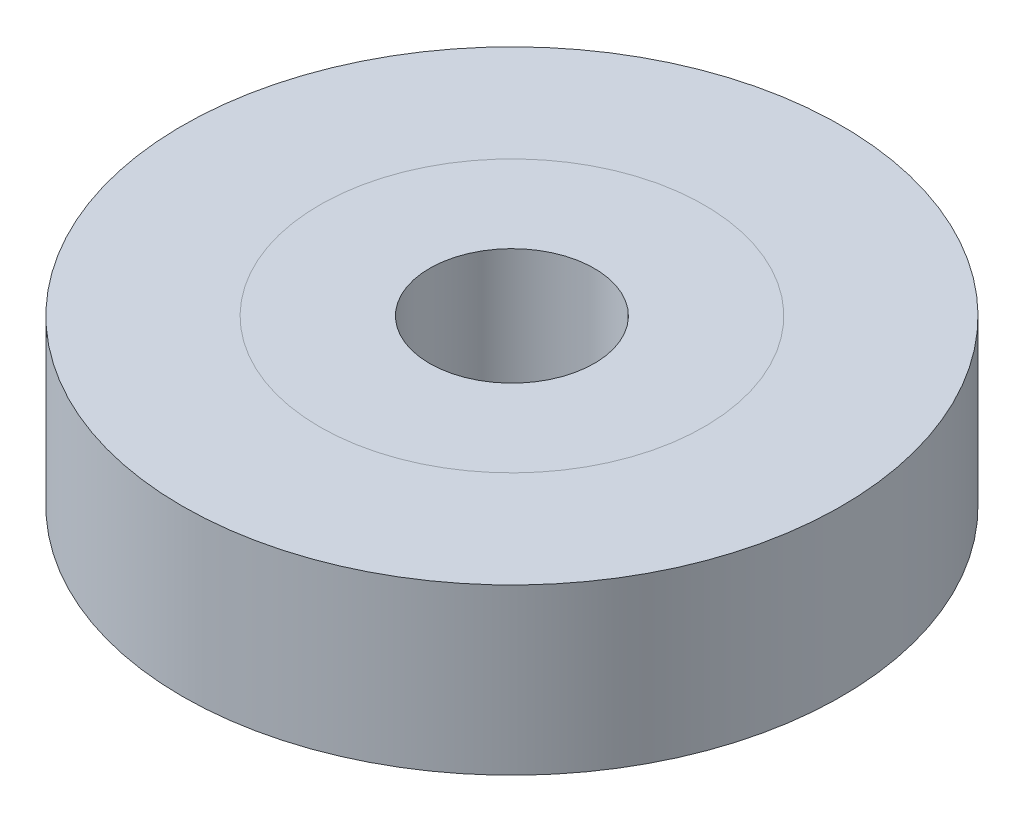
ISO-10303-21;
HEADER;
FILE_DESCRIPTION(('STEP AP214'),'2;1');
FILE_NAME('part.step','',(''),(''),'','','');
FILE_SCHEMA(('AUTOMOTIVE_DESIGN { 1 0 10303 214 1 1 1 1 }'));
ENDSEC;
DATA;
#1=APPLICATION_CONTEXT('core data for automotive mechanical design processes');
#2=APPLICATION_PROTOCOL_DEFINITION('international standard','automotive_design',2000,#1);
#3=PRODUCT_CONTEXT('',#1,'mechanical');
#4=PRODUCT('Part','Part','',(#3));
#5=PRODUCT_RELATED_PRODUCT_CATEGORY('part','',(#4));
#6=PRODUCT_DEFINITION_FORMATION('','',#4);
#7=PRODUCT_DEFINITION_CONTEXT('part definition',#1,'design');
#8=PRODUCT_DEFINITION('design','',#6,#7);
#9=PRODUCT_DEFINITION_SHAPE('','',#8);
#10=(LENGTH_UNIT() NAMED_UNIT(*) SI_UNIT(.MILLI.,.METRE.));
#11=(NAMED_UNIT(*) PLANE_ANGLE_UNIT() SI_UNIT($,.RADIAN.));
#12=(NAMED_UNIT(*) SI_UNIT($,.STERADIAN.) SOLID_ANGLE_UNIT());
#13=UNCERTAINTY_MEASURE_WITH_UNIT(LENGTH_MEASURE(1.E-05),#10,'distance_accuracy_value','');
#14=(GEOMETRIC_REPRESENTATION_CONTEXT(3) GLOBAL_UNCERTAINTY_ASSIGNED_CONTEXT((#13)) GLOBAL_UNIT_ASSIGNED_CONTEXT((#10,
#11,#12)) REPRESENTATION_CONTEXT('',''));
#15=CARTESIAN_POINT('',(0.,0.,0.));
#16=DIRECTION('',(0.,0.,1.));
#17=DIRECTION('',(1.,0.,0.));
#18=AXIS2_PLACEMENT_3D('',#15,#16,#17);
#19=CARTESIAN_POINT('',(0.,1.5,0.));
#20=DIRECTION('',(0.,1.,0.));
#21=DIRECTION('',(0.,0.,1.));
#22=AXIS2_PLACEMENT_3D('',#19,#20,#21);
#23=PLANE('',#22);
#24=CARTESIAN_POINT('',(0.,1.5,0.));
#25=DIRECTION('',(0.,1.,0.));
#26=DIRECTION('',(0.,0.,1.));
#27=AXIS2_PLACEMENT_3D('',#24,#25,#26);
#28=CIRCLE('',#27,6.);
#29=CARTESIAN_POINT('',(0.,1.5,6.));
#30=VERTEX_POINT('',#29);
#31=EDGE_CURVE('E11',#30,#30,#28,.T.);
#32=ORIENTED_EDGE('',*,*,#31,.T.);
#33=EDGE_LOOP('',(#32));
#34=FACE_BOUND('',#33,.T.);
#35=CARTESIAN_POINT('',(0.,1.5,0.));
#36=DIRECTION('',(0.,1.,0.));
#37=DIRECTION('',(0.,0.,1.));
#38=AXIS2_PLACEMENT_3D('',#35,#36,#37);
#39=CIRCLE('',#38,3.5);
#40=CARTESIAN_POINT('',(0.,1.5,3.5));
#41=VERTEX_POINT('',#40);
#42=EDGE_CURVE('E58',#41,#41,#39,.T.);
#43=ORIENTED_EDGE('',*,*,#42,.F.);
#44=EDGE_LOOP('',(#43));
#45=FACE_BOUND('',#44,.T.);
#46=ADVANCED_FACE('F47',(#34,#45),#23,.T.);
#47=CARTESIAN_POINT('',(0.,-1.5,0.));
#48=DIRECTION('',(0.,1.,0.));
#49=DIRECTION('',(0.,0.,1.));
#50=AXIS2_PLACEMENT_3D('',#47,#48,#49);
#51=PLANE('',#50);
#52=CARTESIAN_POINT('',(0.,-1.5,0.));
#53=DIRECTION('',(0.,1.,0.));
#54=DIRECTION('',(0.,0.,1.));
#55=AXIS2_PLACEMENT_3D('',#52,#53,#54);
#56=CIRCLE('',#55,6.);
#57=CARTESIAN_POINT('',(0.,-1.5,6.));
#58=VERTEX_POINT('',#57);
#59=EDGE_CURVE('E51',#58,#58,#56,.T.);
#60=ORIENTED_EDGE('',*,*,#59,.F.);
#61=EDGE_LOOP('',(#60));
#62=FACE_BOUND('',#61,.T.);
#63=CARTESIAN_POINT('',(0.,-1.5,0.));
#64=DIRECTION('',(0.,1.,0.));
#65=DIRECTION('',(0.,0.,1.));
#66=AXIS2_PLACEMENT_3D('',#63,#64,#65);
#67=CIRCLE('',#66,3.5);
#68=CARTESIAN_POINT('',(0.,-1.5,3.5));
#69=VERTEX_POINT('',#68);
#70=EDGE_CURVE('E60',#69,#69,#67,.T.);
#71=ORIENTED_EDGE('',*,*,#70,.T.);
#72=EDGE_LOOP('',(#71));
#73=FACE_BOUND('',#72,.T.);
#74=ADVANCED_FACE('F70',(#62,#73),#51,.F.);
#75=CARTESIAN_POINT('',(0.,1.5,0.));
#76=DIRECTION('',(0.,-1.,0.));
#77=DIRECTION('',(0.,0.,-1.));
#78=AXIS2_PLACEMENT_3D('',#75,#76,#77);
#79=CYLINDRICAL_SURFACE('',#78,6.);
#80=ORIENTED_EDGE('',*,*,#31,.F.);
#81=EDGE_LOOP('',(#80));
#82=FACE_BOUND('',#81,.T.);
#83=ORIENTED_EDGE('',*,*,#59,.T.);
#84=EDGE_LOOP('',(#83));
#85=FACE_BOUND('',#84,.T.);
#86=ADVANCED_FACE('F49',(#82,#85),#79,.T.);
#87=CARTESIAN_POINT('',(0.,1.5,0.));
#88=DIRECTION('',(0.,-1.,0.));
#89=DIRECTION('',(0.,0.,-1.));
#90=AXIS2_PLACEMENT_3D('',#87,#88,#89);
#91=CYLINDRICAL_SURFACE('',#90,3.5);
#92=ORIENTED_EDGE('',*,*,#42,.T.);
#93=EDGE_LOOP('',(#92));
#94=FACE_BOUND('',#93,.T.);
#95=ORIENTED_EDGE('',*,*,#70,.F.);
#96=EDGE_LOOP('',(#95));
#97=FACE_BOUND('',#96,.T.);
#98=ADVANCED_FACE('F66',(#94,#97),#91,.F.);
#99=CLOSED_SHELL('',(#46,#74,#86,#98));
#100=MANIFOLD_SOLID_BREP('B2',#99);
#101=CARTESIAN_POINT('',(0.,1.5,0.));
#102=DIRECTION('',(0.,1.,0.));
#103=DIRECTION('',(0.,0.,1.));
#104=AXIS2_PLACEMENT_3D('',#101,#102,#103);
#105=PLANE('',#104);
#106=CARTESIAN_POINT('',(0.,1.5,0.));
#107=DIRECTION('',(0.,1.,0.));
#108=DIRECTION('',(0.,0.,1.));
#109=AXIS2_PLACEMENT_3D('',#106,#107,#108);
#110=CIRCLE('',#109,3.5);
#111=CARTESIAN_POINT('',(0.,1.5,3.5));
#112=VERTEX_POINT('',#111);
#113=EDGE_CURVE('E46',#112,#112,#110,.T.);
#114=ORIENTED_EDGE('',*,*,#113,.T.);
#115=EDGE_LOOP('',(#114));
#116=FACE_BOUND('',#115,.T.);
#117=CARTESIAN_POINT('',(0.,1.5,0.));
#118=DIRECTION('',(0.,1.,0.));
#119=DIRECTION('',(0.,0.,1.));
#120=AXIS2_PLACEMENT_3D('',#117,#118,#119);
#121=CIRCLE('',#120,1.5);
#122=CARTESIAN_POINT('',(0.,1.5,1.5));
#123=VERTEX_POINT('',#122);
#124=EDGE_CURVE('E112',#123,#123,#121,.T.);
#125=ORIENTED_EDGE('',*,*,#124,.F.);
#126=EDGE_LOOP('',(#125));
#127=FACE_BOUND('',#126,.T.);
#128=ADVANCED_FACE('F101',(#116,#127),#105,.T.);
#129=CARTESIAN_POINT('',(0.,-1.5,0.));
#130=DIRECTION('',(0.,1.,0.));
#131=DIRECTION('',(0.,0.,1.));
#132=AXIS2_PLACEMENT_3D('',#129,#130,#131);
#133=PLANE('',#132);
#134=CARTESIAN_POINT('',(0.,-1.5,0.));
#135=DIRECTION('',(0.,1.,0.));
#136=DIRECTION('',(0.,0.,1.));
#137=AXIS2_PLACEMENT_3D('',#134,#135,#136);
#138=CIRCLE('',#137,3.5);
#139=CARTESIAN_POINT('',(0.,-1.5,3.5));
#140=VERTEX_POINT('',#139);
#141=EDGE_CURVE('E105',#140,#140,#138,.T.);
#142=ORIENTED_EDGE('',*,*,#141,.F.);
#143=EDGE_LOOP('',(#142));
#144=FACE_BOUND('',#143,.T.);
#145=CARTESIAN_POINT('',(0.,-1.5,0.));
#146=DIRECTION('',(0.,1.,0.));
#147=DIRECTION('',(0.,0.,1.));
#148=AXIS2_PLACEMENT_3D('',#145,#146,#147);
#149=CIRCLE('',#148,1.5);
#150=CARTESIAN_POINT('',(0.,-1.5,1.5));
#151=VERTEX_POINT('',#150);
#152=EDGE_CURVE('E114',#151,#151,#149,.T.);
#153=ORIENTED_EDGE('',*,*,#152,.T.);
#154=EDGE_LOOP('',(#153));
#155=FACE_BOUND('',#154,.T.);
#156=ADVANCED_FACE('F124',(#144,#155),#133,.F.);
#157=CARTESIAN_POINT('',(0.,1.5,0.));
#158=DIRECTION('',(0.,-1.,0.));
#159=DIRECTION('',(0.,0.,-1.));
#160=AXIS2_PLACEMENT_3D('',#157,#158,#159);
#161=CYLINDRICAL_SURFACE('',#160,3.5);
#162=ORIENTED_EDGE('',*,*,#113,.F.);
#163=EDGE_LOOP('',(#162));
#164=FACE_BOUND('',#163,.T.);
#165=ORIENTED_EDGE('',*,*,#141,.T.);
#166=EDGE_LOOP('',(#165));
#167=FACE_BOUND('',#166,.T.);
#168=ADVANCED_FACE('F103',(#164,#167),#161,.T.);
#169=CARTESIAN_POINT('',(0.,1.5,0.));
#170=DIRECTION('',(0.,-1.,0.));
#171=DIRECTION('',(0.,0.,-1.));
#172=AXIS2_PLACEMENT_3D('',#169,#170,#171);
#173=CYLINDRICAL_SURFACE('',#172,1.5);
#174=ORIENTED_EDGE('',*,*,#124,.T.);
#175=EDGE_LOOP('',(#174));
#176=FACE_BOUND('',#175,.T.);
#177=ORIENTED_EDGE('',*,*,#152,.F.);
#178=EDGE_LOOP('',(#177));
#179=FACE_BOUND('',#178,.T.);
#180=ADVANCED_FACE('F120',(#176,#179),#173,.F.);
#181=CLOSED_SHELL('',(#128,#156,#168,#180));
#182=MANIFOLD_SOLID_BREP('B6',#181);
#183=ADVANCED_BREP_SHAPE_REPRESENTATION('',(#18,#100,#182),#14);
#184=SHAPE_DEFINITION_REPRESENTATION(#9,#183);
ENDSEC;
END-ISO-10303-21;
